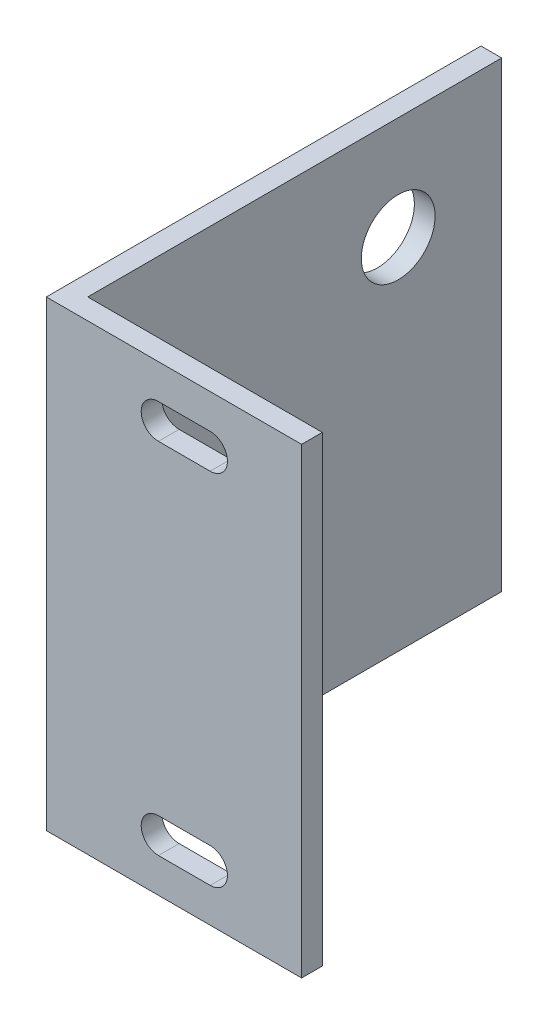
ISO-10303-21;
HEADER;
FILE_DESCRIPTION(('STEP AP214'),'2;1');
FILE_NAME('part.step','',(''),(''),'','','');
FILE_SCHEMA(('AUTOMOTIVE_DESIGN { 1 0 10303 214 1 1 1 1 }'));
ENDSEC;
DATA;
#1=APPLICATION_CONTEXT('core data for automotive mechanical design processes');
#2=APPLICATION_PROTOCOL_DEFINITION('international standard','automotive_design',2000,#1);
#3=PRODUCT_CONTEXT('',#1,'mechanical');
#4=PRODUCT('Part','Part','',(#3));
#5=PRODUCT_RELATED_PRODUCT_CATEGORY('part','',(#4));
#6=PRODUCT_DEFINITION_FORMATION('','',#4);
#7=PRODUCT_DEFINITION_CONTEXT('part definition',#1,'design');
#8=PRODUCT_DEFINITION('design','',#6,#7);
#9=PRODUCT_DEFINITION_SHAPE('','',#8);
#10=(LENGTH_UNIT() NAMED_UNIT(*) SI_UNIT(.MILLI.,.METRE.));
#11=(NAMED_UNIT(*) PLANE_ANGLE_UNIT() SI_UNIT($,.RADIAN.));
#12=(NAMED_UNIT(*) SI_UNIT($,.STERADIAN.) SOLID_ANGLE_UNIT());
#13=UNCERTAINTY_MEASURE_WITH_UNIT(LENGTH_MEASURE(1.E-05),#10,'distance_accuracy_value','');
#14=(GEOMETRIC_REPRESENTATION_CONTEXT(3) GLOBAL_UNCERTAINTY_ASSIGNED_CONTEXT((#13)) GLOBAL_UNIT_ASSIGNED_CONTEXT((#10,
#11,#12)) REPRESENTATION_CONTEXT('',''));
#15=CARTESIAN_POINT('',(0.,0.,0.));
#16=DIRECTION('',(0.,0.,1.));
#17=DIRECTION('',(1.,0.,0.));
#18=AXIS2_PLACEMENT_3D('',#15,#16,#17);
#19=CARTESIAN_POINT('',(-15.5,66.99,0.));
#20=DIRECTION('',(1.,0.,0.));
#21=DIRECTION('',(0.,0.,-1.));
#22=AXIS2_PLACEMENT_3D('',#19,#20,#21);
#23=PLANE('',#22);
#24=CARTESIAN_POINT('',(-15.5,15.,-16.5));
#25=DIRECTION('',(1.,0.,0.));
#26=DIRECTION('',(0.,0.,-1.));
#27=AXIS2_PLACEMENT_3D('',#24,#25,#26);
#28=CIRCLE('',#27,5.35);
#29=CARTESIAN_POINT('',(-15.5,15.,-21.85));
#30=VERTEX_POINT('',#29);
#31=EDGE_CURVE('E244',#30,#30,#28,.T.);
#32=ORIENTED_EDGE('',*,*,#31,.F.);
#33=EDGE_LOOP('',(#32));
#34=FACE_BOUND('',#33,.T.);
#35=CARTESIAN_POINT('',(-15.5,51.9883850012406,-46.5));
#36=DIRECTION('',(1.,0.,0.));
#37=DIRECTION('',(0.,0.,-1.));
#38=AXIS2_PLACEMENT_3D('',#35,#36,#37);
#39=CIRCLE('',#38,5.35);
#40=CARTESIAN_POINT('',(-15.5,51.9883850012406,-51.85));
#41=VERTEX_POINT('',#40);
#42=EDGE_CURVE('E248',#41,#41,#39,.T.);
#43=ORIENTED_EDGE('',*,*,#42,.F.);
#44=EDGE_LOOP('',(#43));
#45=FACE_BOUND('',#44,.T.);
#46=DIRECTION('',(0.,0.,1.));
#47=VECTOR('',#46,1.);
#48=CARTESIAN_POINT('',(-15.5,0.,0.));
#49=LINE('',#48,#47);
#50=CARTESIAN_POINT('',(-15.5,0.,-61.5));
#51=VERTEX_POINT('',#50);
#52=CARTESIAN_POINT('',(-15.5,0.,-1.5));
#53=VERTEX_POINT('',#52);
#54=EDGE_CURVE('E243',#51,#53,#49,.T.);
#55=ORIENTED_EDGE('',*,*,#54,.F.);
#56=DIRECTION('',(0.,-1.,0.));
#57=VECTOR('',#56,1.);
#58=CARTESIAN_POINT('',(-15.5,66.99,-61.5));
#59=LINE('',#58,#57);
#60=CARTESIAN_POINT('',(-15.5,66.99,-61.5));
#61=VERTEX_POINT('',#60);
#62=EDGE_CURVE('E11',#61,#51,#59,.T.);
#63=ORIENTED_EDGE('',*,*,#62,.F.);
#64=DIRECTION('',(0.,0.,1.));
#65=VECTOR('',#64,1.);
#66=CARTESIAN_POINT('',(-15.5,66.99,0.));
#67=LINE('',#66,#65);
#68=CARTESIAN_POINT('',(-15.5,66.99,-1.5));
#69=VERTEX_POINT('',#68);
#70=EDGE_CURVE('E255',#61,#69,#67,.T.);
#71=ORIENTED_EDGE('',*,*,#70,.T.);
#72=DIRECTION('',(0.,-1.,0.));
#73=VECTOR('',#72,1.);
#74=CARTESIAN_POINT('',(-15.5,66.99,-1.5));
#75=LINE('',#74,#73);
#76=EDGE_CURVE('E279',#69,#53,#75,.T.);
#77=ORIENTED_EDGE('',*,*,#76,.T.);
#78=EDGE_LOOP('',(#55,#63,#71,#77));
#79=FACE_BOUND('',#78,.T.);
#80=ADVANCED_FACE('F44',(#34,#45,#79),#23,.T.);
#81=CARTESIAN_POINT('',(0.,66.99,-61.5));
#82=DIRECTION('',(0.,0.,-1.));
#83=DIRECTION('',(-1.,0.,0.));
#84=AXIS2_PLACEMENT_3D('',#81,#82,#83);
#85=PLANE('',#84);
#86=DIRECTION('',(1.,0.,0.));
#87=VECTOR('',#86,1.);
#88=CARTESIAN_POINT('',(0.,0.,-61.5));
#89=LINE('',#88,#87);
#90=CARTESIAN_POINT('',(-18.5,0.,-61.5));
#91=VERTEX_POINT('',#90);
#92=EDGE_CURVE('E283',#91,#51,#89,.T.);
#93=ORIENTED_EDGE('',*,*,#92,.F.);
#94=DIRECTION('',(0.,-1.,0.));
#95=VECTOR('',#94,1.);
#96=CARTESIAN_POINT('',(-18.5,66.99,-61.5));
#97=LINE('',#96,#95);
#98=CARTESIAN_POINT('',(-18.5,66.99,-61.5));
#99=VERTEX_POINT('',#98);
#100=EDGE_CURVE('E52',#99,#91,#97,.T.);
#101=ORIENTED_EDGE('',*,*,#100,.F.);
#102=DIRECTION('',(1.,0.,0.));
#103=VECTOR('',#102,1.);
#104=CARTESIAN_POINT('',(0.,66.99,-61.5));
#105=LINE('',#104,#103);
#106=EDGE_CURVE('E259',#99,#61,#105,.T.);
#107=ORIENTED_EDGE('',*,*,#106,.T.);
#108=ORIENTED_EDGE('',*,*,#62,.T.);
#109=EDGE_LOOP('',(#93,#101,#107,#108));
#110=FACE_BOUND('',#109,.T.);
#111=ADVANCED_FACE('F320',(#110),#85,.T.);
#112=CARTESIAN_POINT('',(-18.5,66.99,0.));
#113=DIRECTION('',(-1.,0.,0.));
#114=DIRECTION('',(0.,0.,1.));
#115=AXIS2_PLACEMENT_3D('',#112,#113,#114);
#116=PLANE('',#115);
#117=CARTESIAN_POINT('',(-18.5,15.,-16.5));
#118=DIRECTION('',(1.,0.,0.));
#119=DIRECTION('',(0.,0.,-1.));
#120=AXIS2_PLACEMENT_3D('',#117,#118,#119);
#121=CIRCLE('',#120,5.35);
#122=CARTESIAN_POINT('',(-18.5,15.,-21.85));
#123=VERTEX_POINT('',#122);
#124=EDGE_CURVE('E239',#123,#123,#121,.T.);
#125=ORIENTED_EDGE('',*,*,#124,.T.);
#126=EDGE_LOOP('',(#125));
#127=FACE_BOUND('',#126,.T.);
#128=CARTESIAN_POINT('',(-18.5,51.9883850012406,-46.5));
#129=DIRECTION('',(1.,0.,0.));
#130=DIRECTION('',(0.,0.,-1.));
#131=AXIS2_PLACEMENT_3D('',#128,#129,#130);
#132=CIRCLE('',#131,5.35);
#133=CARTESIAN_POINT('',(-18.5,51.9883850012406,-51.85));
#134=VERTEX_POINT('',#133);
#135=EDGE_CURVE('E192',#134,#134,#132,.T.);
#136=ORIENTED_EDGE('',*,*,#135,.T.);
#137=EDGE_LOOP('',(#136));
#138=FACE_BOUND('',#137,.T.);
#139=DIRECTION('',(0.,0.,-1.));
#140=VECTOR('',#139,1.);
#141=CARTESIAN_POINT('',(-18.5,0.,0.));
#142=LINE('',#141,#140);
#143=CARTESIAN_POINT('',(-18.5,0.,1.5));
#144=VERTEX_POINT('',#143);
#145=EDGE_CURVE('E287',#144,#91,#142,.T.);
#146=ORIENTED_EDGE('',*,*,#145,.F.);
#147=DIRECTION('',(0.,-1.,0.));
#148=VECTOR('',#147,1.);
#149=CARTESIAN_POINT('',(-18.5,66.99,1.5));
#150=LINE('',#149,#148);
#151=CARTESIAN_POINT('',(-18.5,66.99,1.5));
#152=VERTEX_POINT('',#151);
#153=EDGE_CURVE('E310',#152,#144,#150,.T.);
#154=ORIENTED_EDGE('',*,*,#153,.F.);
#155=DIRECTION('',(0.,0.,-1.));
#156=VECTOR('',#155,1.);
#157=CARTESIAN_POINT('',(-18.5,66.99,0.));
#158=LINE('',#157,#156);
#159=EDGE_CURVE('E264',#152,#99,#158,.T.);
#160=ORIENTED_EDGE('',*,*,#159,.T.);
#161=ORIENTED_EDGE('',*,*,#100,.T.);
#162=EDGE_LOOP('',(#146,#154,#160,#161));
#163=FACE_BOUND('',#162,.T.);
#164=ADVANCED_FACE('F316',(#127,#138,#163),#116,.T.);
#165=CARTESIAN_POINT('',(0.,66.99,1.5));
#166=DIRECTION('',(0.,0.,-1.));
#167=DIRECTION('',(-1.,0.,0.));
#168=AXIS2_PLACEMENT_3D('',#165,#166,#167);
#169=PLANE('',#168);
#170=DIRECTION('',(1.,0.,0.));
#171=VECTOR('',#170,1.);
#172=CARTESIAN_POINT('',(5.25,10.,1.5));
#173=LINE('',#172,#171);
#174=CARTESIAN_POINT('',(-2.25,10.,1.5));
#175=VERTEX_POINT('',#174);
#176=CARTESIAN_POINT('',(5.25,10.,1.5));
#177=VERTEX_POINT('',#176);
#178=EDGE_CURVE('E157',#175,#177,#173,.T.);
#179=ORIENTED_EDGE('',*,*,#178,.T.);
#180=CARTESIAN_POINT('',(5.25,7.5,1.5));
#181=DIRECTION('',(0.,0.,-1.));
#182=DIRECTION('',(-1.,0.,0.));
#183=AXIS2_PLACEMENT_3D('',#180,#181,#182);
#184=CIRCLE('',#183,2.5);
#185=CARTESIAN_POINT('',(5.25,5.,1.5));
#186=VERTEX_POINT('',#185);
#187=EDGE_CURVE('E148',#177,#186,#184,.T.);
#188=ORIENTED_EDGE('',*,*,#187,.T.);
#189=DIRECTION('',(-1.,0.,0.));
#190=VECTOR('',#189,1.);
#191=CARTESIAN_POINT('',(5.25,5.,1.5));
#192=LINE('',#191,#190);
#193=CARTESIAN_POINT('',(-2.25,5.,1.5));
#194=VERTEX_POINT('',#193);
#195=EDGE_CURVE('E160',#186,#194,#192,.T.);
#196=ORIENTED_EDGE('',*,*,#195,.T.);
#197=CARTESIAN_POINT('',(-2.25,7.5,1.5));
#198=DIRECTION('',(0.,0.,-1.));
#199=DIRECTION('',(-1.,0.,0.));
#200=AXIS2_PLACEMENT_3D('',#197,#198,#199);
#201=CIRCLE('',#200,2.5);
#202=EDGE_CURVE('E59',#194,#175,#201,.T.);
#203=ORIENTED_EDGE('',*,*,#202,.T.);
#204=EDGE_LOOP('',(#179,#188,#196,#203));
#205=FACE_BOUND('',#204,.T.);
#206=DIRECTION('',(1.,0.,0.));
#207=VECTOR('',#206,1.);
#208=CARTESIAN_POINT('',(5.25,61.99,1.5));
#209=LINE('',#208,#207);
#210=CARTESIAN_POINT('',(-2.25,61.99,1.5));
#211=VERTEX_POINT('',#210);
#212=CARTESIAN_POINT('',(5.25,61.99,1.5));
#213=VERTEX_POINT('',#212);
#214=EDGE_CURVE('E202',#211,#213,#209,.T.);
#215=ORIENTED_EDGE('',*,*,#214,.T.);
#216=CARTESIAN_POINT('',(5.25,59.49,1.5));
#217=DIRECTION('',(0.,0.,-1.));
#218=DIRECTION('',(1.,0.,0.));
#219=AXIS2_PLACEMENT_3D('',#216,#217,#218);
#220=CIRCLE('',#219,2.5);
#221=CARTESIAN_POINT('',(5.25,56.99,1.5));
#222=VERTEX_POINT('',#221);
#223=EDGE_CURVE('E217',#213,#222,#220,.T.);
#224=ORIENTED_EDGE('',*,*,#223,.T.);
#225=DIRECTION('',(-1.,0.,0.));
#226=VECTOR('',#225,1.);
#227=CARTESIAN_POINT('',(5.25,56.99,1.5));
#228=LINE('',#227,#226);
#229=CARTESIAN_POINT('',(-2.25,56.99,1.5));
#230=VERTEX_POINT('',#229);
#231=EDGE_CURVE('E232',#222,#230,#228,.T.);
#232=ORIENTED_EDGE('',*,*,#231,.T.);
#233=CARTESIAN_POINT('',(-2.25,59.49,1.5));
#234=DIRECTION('',(0.,0.,-1.));
#235=DIRECTION('',(1.,0.,0.));
#236=AXIS2_PLACEMENT_3D('',#233,#234,#235);
#237=CIRCLE('',#236,2.5);
#238=EDGE_CURVE('E67',#230,#211,#237,.T.);
#239=ORIENTED_EDGE('',*,*,#238,.T.);
#240=EDGE_LOOP('',(#215,#224,#232,#239));
#241=FACE_BOUND('',#240,.T.);
#242=DIRECTION('',(1.,0.,0.));
#243=VECTOR('',#242,1.);
#244=CARTESIAN_POINT('',(0.,0.,1.5));
#245=LINE('',#244,#243);
#246=CARTESIAN_POINT('',(18.5,0.,1.5));
#247=VERTEX_POINT('',#246);
#248=EDGE_CURVE('E291',#144,#247,#245,.T.);
#249=ORIENTED_EDGE('',*,*,#248,.T.);
#250=DIRECTION('',(0.,-1.,0.));
#251=VECTOR('',#250,1.);
#252=CARTESIAN_POINT('',(18.5,66.99,1.5));
#253=LINE('',#252,#251);
#254=CARTESIAN_POINT('',(18.5,66.99,1.5));
#255=VERTEX_POINT('',#254);
#256=EDGE_CURVE('E307',#255,#247,#253,.T.);
#257=ORIENTED_EDGE('',*,*,#256,.F.);
#258=DIRECTION('',(1.,0.,0.));
#259=VECTOR('',#258,1.);
#260=CARTESIAN_POINT('',(0.,66.99,1.5));
#261=LINE('',#260,#259);
#262=EDGE_CURVE('E268',#152,#255,#261,.T.);
#263=ORIENTED_EDGE('',*,*,#262,.F.);
#264=ORIENTED_EDGE('',*,*,#153,.T.);
#265=EDGE_LOOP('',(#249,#257,#263,#264));
#266=FACE_BOUND('',#265,.T.);
#267=ADVANCED_FACE('F165',(#205,#241,#266),#169,.F.);
#268=CARTESIAN_POINT('',(18.5,66.99,0.));
#269=DIRECTION('',(1.,0.,0.));
#270=DIRECTION('',(0.,0.,-1.));
#271=AXIS2_PLACEMENT_3D('',#268,#269,#270);
#272=PLANE('',#271);
#273=DIRECTION('',(0.,0.,1.));
#274=VECTOR('',#273,1.);
#275=CARTESIAN_POINT('',(18.5,0.,0.));
#276=LINE('',#275,#274);
#277=CARTESIAN_POINT('',(18.5,0.,-1.5));
#278=VERTEX_POINT('',#277);
#279=EDGE_CURVE('E295',#278,#247,#276,.T.);
#280=ORIENTED_EDGE('',*,*,#279,.F.);
#281=DIRECTION('',(0.,-1.,0.));
#282=VECTOR('',#281,1.);
#283=CARTESIAN_POINT('',(18.5,66.99,-1.5));
#284=LINE('',#283,#282);
#285=CARTESIAN_POINT('',(18.5,66.99,-1.5));
#286=VERTEX_POINT('',#285);
#287=EDGE_CURVE('E304',#286,#278,#284,.T.);
#288=ORIENTED_EDGE('',*,*,#287,.F.);
#289=DIRECTION('',(0.,0.,1.));
#290=VECTOR('',#289,1.);
#291=CARTESIAN_POINT('',(18.5,66.99,0.));
#292=LINE('',#291,#290);
#293=EDGE_CURVE('E271',#286,#255,#292,.T.);
#294=ORIENTED_EDGE('',*,*,#293,.T.);
#295=ORIENTED_EDGE('',*,*,#256,.T.);
#296=EDGE_LOOP('',(#280,#288,#294,#295));
#297=FACE_BOUND('',#296,.T.);
#298=ADVANCED_FACE('F339',(#297),#272,.T.);
#299=CARTESIAN_POINT('',(0.,66.99,-1.5));
#300=DIRECTION('',(0.,0.,-1.));
#301=DIRECTION('',(-1.,0.,0.));
#302=AXIS2_PLACEMENT_3D('',#299,#300,#301);
#303=PLANE('',#302);
#304=CARTESIAN_POINT('',(5.25,7.5,-1.5));
#305=DIRECTION('',(0.,0.,-1.));
#306=DIRECTION('',(-1.,0.,0.));
#307=AXIS2_PLACEMENT_3D('',#304,#305,#306);
#308=CIRCLE('',#307,2.5);
#309=CARTESIAN_POINT('',(5.25,10.,-1.5));
#310=VERTEX_POINT('',#309);
#311=CARTESIAN_POINT('',(5.25,5.,-1.5));
#312=VERTEX_POINT('',#311);
#313=EDGE_CURVE('E151',#310,#312,#308,.T.);
#314=ORIENTED_EDGE('',*,*,#313,.F.);
#315=DIRECTION('',(1.,0.,0.));
#316=VECTOR('',#315,1.);
#317=CARTESIAN_POINT('',(5.25,10.,-1.5));
#318=LINE('',#317,#316);
#319=CARTESIAN_POINT('',(-2.25,10.,-1.5));
#320=VERTEX_POINT('',#319);
#321=EDGE_CURVE('E169',#320,#310,#318,.T.);
#322=ORIENTED_EDGE('',*,*,#321,.F.);
#323=CARTESIAN_POINT('',(-2.25,7.5,-1.5));
#324=DIRECTION('',(0.,0.,-1.));
#325=DIRECTION('',(-1.,0.,0.));
#326=AXIS2_PLACEMENT_3D('',#323,#324,#325);
#327=CIRCLE('',#326,2.5);
#328=CARTESIAN_POINT('',(-2.25,5.,-1.5));
#329=VERTEX_POINT('',#328);
#330=EDGE_CURVE('E173',#329,#320,#327,.T.);
#331=ORIENTED_EDGE('',*,*,#330,.F.);
#332=DIRECTION('',(-1.,0.,0.));
#333=VECTOR('',#332,1.);
#334=CARTESIAN_POINT('',(5.25,5.,-1.5));
#335=LINE('',#334,#333);
#336=EDGE_CURVE('E182',#312,#329,#335,.T.);
#337=ORIENTED_EDGE('',*,*,#336,.F.);
#338=EDGE_LOOP('',(#314,#322,#331,#337));
#339=FACE_BOUND('',#338,.T.);
#340=CARTESIAN_POINT('',(5.25,59.49,-1.5));
#341=DIRECTION('',(0.,0.,-1.));
#342=DIRECTION('',(1.,0.,0.));
#343=AXIS2_PLACEMENT_3D('',#340,#341,#342);
#344=CIRCLE('',#343,2.5);
#345=CARTESIAN_POINT('',(5.25,61.99,-1.5));
#346=VERTEX_POINT('',#345);
#347=CARTESIAN_POINT('',(5.25,56.99,-1.5));
#348=VERTEX_POINT('',#347);
#349=EDGE_CURVE('E183',#346,#348,#344,.T.);
#350=ORIENTED_EDGE('',*,*,#349,.F.);
#351=DIRECTION('',(1.,0.,0.));
#352=VECTOR('',#351,1.);
#353=CARTESIAN_POINT('',(5.25,61.99,-1.5));
#354=LINE('',#353,#352);
#355=CARTESIAN_POINT('',(-2.25,61.99,-1.5));
#356=VERTEX_POINT('',#355);
#357=EDGE_CURVE('E212',#356,#346,#354,.T.);
#358=ORIENTED_EDGE('',*,*,#357,.F.);
#359=CARTESIAN_POINT('',(-2.25,59.49,-1.5));
#360=DIRECTION('',(0.,0.,-1.));
#361=DIRECTION('',(1.,0.,0.));
#362=AXIS2_PLACEMENT_3D('',#359,#360,#361);
#363=CIRCLE('',#362,2.5);
#364=CARTESIAN_POINT('',(-2.25,56.99,-1.5));
#365=VERTEX_POINT('',#364);
#366=EDGE_CURVE('E216',#365,#356,#363,.T.);
#367=ORIENTED_EDGE('',*,*,#366,.F.);
#368=DIRECTION('',(-1.,0.,0.));
#369=VECTOR('',#368,1.);
#370=CARTESIAN_POINT('',(5.25,56.99,-1.5));
#371=LINE('',#370,#369);
#372=EDGE_CURVE('E221',#348,#365,#371,.T.);
#373=ORIENTED_EDGE('',*,*,#372,.F.);
#374=EDGE_LOOP('',(#350,#358,#367,#373));
#375=FACE_BOUND('',#374,.T.);
#376=DIRECTION('',(1.,0.,0.));
#377=VECTOR('',#376,1.);
#378=CARTESIAN_POINT('',(0.,0.,-1.5));
#379=LINE('',#378,#377);
#380=EDGE_CURVE('E260',#53,#278,#379,.T.);
#381=ORIENTED_EDGE('',*,*,#380,.F.);
#382=ORIENTED_EDGE('',*,*,#76,.F.);
#383=DIRECTION('',(1.,0.,0.));
#384=VECTOR('',#383,1.);
#385=CARTESIAN_POINT('',(0.,66.99,-1.5));
#386=LINE('',#385,#384);
#387=EDGE_CURVE('E275',#69,#286,#386,.T.);
#388=ORIENTED_EDGE('',*,*,#387,.T.);
#389=ORIENTED_EDGE('',*,*,#287,.T.);
#390=EDGE_LOOP('',(#381,#382,#388,#389));
#391=FACE_BOUND('',#390,.T.);
#392=ADVANCED_FACE('F337',(#339,#375,#391),#303,.T.);
#393=CARTESIAN_POINT('',(0.,66.99,0.));
#394=DIRECTION('',(0.,1.,0.));
#395=DIRECTION('',(0.,0.,1.));
#396=AXIS2_PLACEMENT_3D('',#393,#394,#395);
#397=PLANE('',#396);
#398=ORIENTED_EDGE('',*,*,#70,.F.);
#399=ORIENTED_EDGE('',*,*,#106,.F.);
#400=ORIENTED_EDGE('',*,*,#159,.F.);
#401=ORIENTED_EDGE('',*,*,#262,.T.);
#402=ORIENTED_EDGE('',*,*,#293,.F.);
#403=ORIENTED_EDGE('',*,*,#387,.F.);
#404=EDGE_LOOP('',(#398,#399,#400,#401,#402,#403));
#405=FACE_BOUND('',#404,.T.);
#406=ADVANCED_FACE('F332',(#405),#397,.T.);
#407=CARTESIAN_POINT('',(0.,0.,0.));
#408=DIRECTION('',(0.,1.,0.));
#409=DIRECTION('',(0.,0.,1.));
#410=AXIS2_PLACEMENT_3D('',#407,#408,#409);
#411=PLANE('',#410);
#412=ORIENTED_EDGE('',*,*,#54,.T.);
#413=ORIENTED_EDGE('',*,*,#380,.T.);
#414=ORIENTED_EDGE('',*,*,#279,.T.);
#415=ORIENTED_EDGE('',*,*,#248,.F.);
#416=ORIENTED_EDGE('',*,*,#145,.T.);
#417=ORIENTED_EDGE('',*,*,#92,.T.);
#418=EDGE_LOOP('',(#412,#413,#414,#415,#416,#417));
#419=FACE_BOUND('',#418,.T.);
#420=ADVANCED_FACE('F324',(#419),#411,.F.);
#421=CARTESIAN_POINT('',(-18.5,51.9883850012406,-46.5));
#422=DIRECTION('',(1.,0.,0.));
#423=DIRECTION('',(0.,0.,-1.));
#424=AXIS2_PLACEMENT_3D('',#421,#422,#423);
#425=CYLINDRICAL_SURFACE('',#424,5.35);
#426=CARTESIAN_POINT('',(-18.5,51.9883850012406,-51.85));
#427=CARTESIAN_POINT('',(-18.46875,51.9883850012406,-51.85));
#428=CARTESIAN_POINT('',(-18.4375,51.9883850012406,-51.85));
#429=CARTESIAN_POINT('',(-18.375,51.9883850012406,-51.85));
#430=CARTESIAN_POINT('',(-18.34375,51.9883850012406,-51.85));
#431=CARTESIAN_POINT('',(-18.28125,51.9883850012406,-51.85));
#432=CARTESIAN_POINT('',(-18.25,51.9883850012406,-51.85));
#433=CARTESIAN_POINT('',(-18.1875,51.9883850012406,-51.85));
#434=CARTESIAN_POINT('',(-18.15625,51.9883850012406,-51.85));
#435=CARTESIAN_POINT('',(-18.09375,51.9883850012406,-51.85));
#436=CARTESIAN_POINT('',(-18.0625,51.9883850012406,-51.85));
#437=CARTESIAN_POINT('',(-18.,51.9883850012406,-51.85));
#438=CARTESIAN_POINT('',(-17.96875,51.9883850012406,-51.85));
#439=CARTESIAN_POINT('',(-17.90625,51.9883850012406,-51.85));
#440=CARTESIAN_POINT('',(-17.875,51.9883850012406,-51.85));
#441=CARTESIAN_POINT('',(-17.8125,51.9883850012406,-51.85));
#442=CARTESIAN_POINT('',(-17.78125,51.9883850012406,-51.85));
#443=CARTESIAN_POINT('',(-17.71875,51.9883850012406,-51.85));
#444=CARTESIAN_POINT('',(-17.6875,51.9883850012406,-51.85));
#445=CARTESIAN_POINT('',(-17.625,51.9883850012406,-51.85));
#446=CARTESIAN_POINT('',(-17.59375,51.9883850012406,-51.85));
#447=CARTESIAN_POINT('',(-17.53125,51.9883850012406,-51.85));
#448=CARTESIAN_POINT('',(-17.5,51.9883850012406,-51.85));
#449=CARTESIAN_POINT('',(-17.4375,51.9883850012406,-51.85));
#450=CARTESIAN_POINT('',(-17.40625,51.9883850012406,-51.85));
#451=CARTESIAN_POINT('',(-17.34375,51.9883850012406,-51.85));
#452=CARTESIAN_POINT('',(-17.3125,51.9883850012406,-51.85));
#453=CARTESIAN_POINT('',(-17.25,51.9883850012406,-51.85));
#454=CARTESIAN_POINT('',(-17.21875,51.9883850012406,-51.85));
#455=CARTESIAN_POINT('',(-17.15625,51.9883850012406,-51.85));
#456=CARTESIAN_POINT('',(-17.125,51.9883850012406,-51.85));
#457=CARTESIAN_POINT('',(-17.0625,51.9883850012406,-51.85));
#458=CARTESIAN_POINT('',(-17.03125,51.9883850012406,-51.85));
#459=CARTESIAN_POINT('',(-16.96875,51.9883850012406,-51.85));
#460=CARTESIAN_POINT('',(-16.9375,51.9883850012406,-51.85));
#461=CARTESIAN_POINT('',(-16.875,51.9883850012406,-51.85));
#462=CARTESIAN_POINT('',(-16.84375,51.9883850012406,-51.85));
#463=CARTESIAN_POINT('',(-16.78125,51.9883850012406,-51.85));
#464=CARTESIAN_POINT('',(-16.75,51.9883850012406,-51.85));
#465=CARTESIAN_POINT('',(-16.6875,51.9883850012406,-51.85));
#466=CARTESIAN_POINT('',(-16.65625,51.9883850012406,-51.85));
#467=CARTESIAN_POINT('',(-16.59375,51.9883850012406,-51.85));
#468=CARTESIAN_POINT('',(-16.5625,51.9883850012406,-51.85));
#469=CARTESIAN_POINT('',(-16.5,51.9883850012406,-51.85));
#470=CARTESIAN_POINT('',(-16.46875,51.9883850012406,-51.85));
#471=CARTESIAN_POINT('',(-16.40625,51.9883850012406,-51.85));
#472=CARTESIAN_POINT('',(-16.375,51.9883850012406,-51.85));
#473=CARTESIAN_POINT('',(-16.3125,51.9883850012406,-51.85));
#474=CARTESIAN_POINT('',(-16.28125,51.9883850012406,-51.85));
#475=CARTESIAN_POINT('',(-16.21875,51.9883850012406,-51.85));
#476=CARTESIAN_POINT('',(-16.1875,51.9883850012406,-51.85));
#477=CARTESIAN_POINT('',(-16.125,51.9883850012406,-51.85));
#478=CARTESIAN_POINT('',(-16.09375,51.9883850012406,-51.85));
#479=CARTESIAN_POINT('',(-16.03125,51.9883850012406,-51.85));
#480=CARTESIAN_POINT('',(-16.,51.9883850012406,-51.85));
#481=CARTESIAN_POINT('',(-15.9375,51.9883850012406,-51.85));
#482=CARTESIAN_POINT('',(-15.90625,51.9883850012406,-51.85));
#483=CARTESIAN_POINT('',(-15.84375,51.9883850012406,-51.85));
#484=CARTESIAN_POINT('',(-15.8125,51.9883850012406,-51.85));
#485=CARTESIAN_POINT('',(-15.75,51.9883850012406,-51.85));
#486=CARTESIAN_POINT('',(-15.71875,51.9883850012406,-51.85));
#487=CARTESIAN_POINT('',(-15.65625,51.9883850012406,-51.85));
#488=CARTESIAN_POINT('',(-15.625,51.9883850012406,-51.85));
#489=CARTESIAN_POINT('',(-15.5625,51.9883850012406,-51.85));
#490=CARTESIAN_POINT('',(-15.53125,51.9883850012406,-51.85));
#491=CARTESIAN_POINT('',(-15.5,51.9883850012406,-51.85));
#492=B_SPLINE_CURVE_WITH_KNOTS('',3,(#426,#427,#428,#429,#430,#431,#432,#433,#434,#435,#436,
#437,#438,#439,#440,#441,#442,#443,#444,#445,#446,#447,#448,#449,#450,#451,#452,#453,#454,#455,
#456,#457,#458,#459,#460,#461,#462,#463,#464,#465,#466,#467,#468,#469,#470,#471,#472,#473,#474,
#475,#476,#477,#478,#479,#480,#481,#482,#483,#484,#485,#486,#487,#488,#489,#490,#491),
.UNSPECIFIED.,.F.,.F.,(4,2,2,2,2,2,2,2,2,2,2,2,2,2,2,2,2,2,2,2,2,2,2,2,2,2,2,2,2,2,2,2,4),(0.,
0.0937500000000001,0.1875,0.28125,0.375,0.46875,0.5625,0.656250000000001,0.750000000000001,
0.843750000000001,0.937500000000001,1.03125,1.125,1.21875,1.3125,1.40625,1.5,1.59375,1.6875,
1.78125,1.875,1.96875,2.0625,2.15625,2.25,2.34375,2.4375,2.53125,2.62500000000001,2.71875,
2.81250000000001,2.90625,3.),.UNSPECIFIED.);
#493=EDGE_CURVE('BSEAM358',#134,#41,#492,.T.);
#494=ORIENTED_EDGE('',*,*,#135,.F.);
#495=ORIENTED_EDGE('',*,*,#42,.T.);
#496=ORIENTED_EDGE('',*,*,#493,.T.);
#497=ORIENTED_EDGE('',*,*,#493,.F.);
#498=EDGE_LOOP('',(#494,#496,#495,#497));
#499=FACE_BOUND('',#498,.T.);
#500=ADVANCED_FACE('F358',(#499),#425,.F.);
#501=CARTESIAN_POINT('',(-18.5,15.,-16.5));
#502=DIRECTION('',(1.,0.,0.));
#503=DIRECTION('',(0.,0.,-1.));
#504=AXIS2_PLACEMENT_3D('',#501,#502,#503);
#505=CYLINDRICAL_SURFACE('',#504,5.35);
#506=CARTESIAN_POINT('',(-18.5,15.,-21.85));
#507=CARTESIAN_POINT('',(-18.46875,15.,-21.85));
#508=CARTESIAN_POINT('',(-18.4375,15.,-21.85));
#509=CARTESIAN_POINT('',(-18.375,15.,-21.85));
#510=CARTESIAN_POINT('',(-18.34375,15.,-21.85));
#511=CARTESIAN_POINT('',(-18.28125,15.,-21.85));
#512=CARTESIAN_POINT('',(-18.25,15.,-21.85));
#513=CARTESIAN_POINT('',(-18.1875,15.,-21.85));
#514=CARTESIAN_POINT('',(-18.15625,15.,-21.85));
#515=CARTESIAN_POINT('',(-18.09375,15.,-21.85));
#516=CARTESIAN_POINT('',(-18.0625,15.,-21.85));
#517=CARTESIAN_POINT('',(-18.,15.,-21.85));
#518=CARTESIAN_POINT('',(-17.96875,15.,-21.85));
#519=CARTESIAN_POINT('',(-17.90625,15.,-21.85));
#520=CARTESIAN_POINT('',(-17.875,15.,-21.85));
#521=CARTESIAN_POINT('',(-17.8125,15.,-21.85));
#522=CARTESIAN_POINT('',(-17.78125,15.,-21.85));
#523=CARTESIAN_POINT('',(-17.71875,15.,-21.85));
#524=CARTESIAN_POINT('',(-17.6875,15.,-21.85));
#525=CARTESIAN_POINT('',(-17.625,15.,-21.85));
#526=CARTESIAN_POINT('',(-17.59375,15.,-21.85));
#527=CARTESIAN_POINT('',(-17.53125,15.,-21.85));
#528=CARTESIAN_POINT('',(-17.5,15.,-21.85));
#529=CARTESIAN_POINT('',(-17.4375,15.,-21.85));
#530=CARTESIAN_POINT('',(-17.40625,15.,-21.85));
#531=CARTESIAN_POINT('',(-17.34375,15.,-21.85));
#532=CARTESIAN_POINT('',(-17.3125,15.,-21.85));
#533=CARTESIAN_POINT('',(-17.25,15.,-21.85));
#534=CARTESIAN_POINT('',(-17.21875,15.,-21.85));
#535=CARTESIAN_POINT('',(-17.15625,15.,-21.85));
#536=CARTESIAN_POINT('',(-17.125,15.,-21.85));
#537=CARTESIAN_POINT('',(-17.0625,15.,-21.85));
#538=CARTESIAN_POINT('',(-17.03125,15.,-21.85));
#539=CARTESIAN_POINT('',(-16.96875,15.,-21.85));
#540=CARTESIAN_POINT('',(-16.9375,15.,-21.85));
#541=CARTESIAN_POINT('',(-16.875,15.,-21.85));
#542=CARTESIAN_POINT('',(-16.84375,15.,-21.85));
#543=CARTESIAN_POINT('',(-16.78125,15.,-21.85));
#544=CARTESIAN_POINT('',(-16.75,15.,-21.85));
#545=CARTESIAN_POINT('',(-16.6875,15.,-21.85));
#546=CARTESIAN_POINT('',(-16.65625,15.,-21.85));
#547=CARTESIAN_POINT('',(-16.59375,15.,-21.85));
#548=CARTESIAN_POINT('',(-16.5625,15.,-21.85));
#549=CARTESIAN_POINT('',(-16.5,15.,-21.85));
#550=CARTESIAN_POINT('',(-16.46875,15.,-21.85));
#551=CARTESIAN_POINT('',(-16.40625,15.,-21.85));
#552=CARTESIAN_POINT('',(-16.375,15.,-21.85));
#553=CARTESIAN_POINT('',(-16.3125,15.,-21.85));
#554=CARTESIAN_POINT('',(-16.28125,15.,-21.85));
#555=CARTESIAN_POINT('',(-16.21875,15.,-21.85));
#556=CARTESIAN_POINT('',(-16.1875,15.,-21.85));
#557=CARTESIAN_POINT('',(-16.125,15.,-21.85));
#558=CARTESIAN_POINT('',(-16.09375,15.,-21.85));
#559=CARTESIAN_POINT('',(-16.03125,15.,-21.85));
#560=CARTESIAN_POINT('',(-16.,15.,-21.85));
#561=CARTESIAN_POINT('',(-15.9375,15.,-21.85));
#562=CARTESIAN_POINT('',(-15.90625,15.,-21.85));
#563=CARTESIAN_POINT('',(-15.84375,15.,-21.85));
#564=CARTESIAN_POINT('',(-15.8125,15.,-21.85));
#565=CARTESIAN_POINT('',(-15.75,15.,-21.85));
#566=CARTESIAN_POINT('',(-15.71875,15.,-21.85));
#567=CARTESIAN_POINT('',(-15.65625,15.,-21.85));
#568=CARTESIAN_POINT('',(-15.625,15.,-21.85));
#569=CARTESIAN_POINT('',(-15.5625,15.,-21.85));
#570=CARTESIAN_POINT('',(-15.53125,15.,-21.85));
#571=CARTESIAN_POINT('',(-15.5,15.,-21.85));
#572=B_SPLINE_CURVE_WITH_KNOTS('',3,(#506,#507,#508,#509,#510,#511,#512,#513,#514,#515,#516,
#517,#518,#519,#520,#521,#522,#523,#524,#525,#526,#527,#528,#529,#530,#531,#532,#533,#534,#535,
#536,#537,#538,#539,#540,#541,#542,#543,#544,#545,#546,#547,#548,#549,#550,#551,#552,#553,#554,
#555,#556,#557,#558,#559,#560,#561,#562,#563,#564,#565,#566,#567,#568,#569,#570,#571),
.UNSPECIFIED.,.F.,.F.,(4,2,2,2,2,2,2,2,2,2,2,2,2,2,2,2,2,2,2,2,2,2,2,2,2,2,2,2,2,2,2,2,4),(0.,
0.0937500000000001,0.1875,0.28125,0.375,0.46875,0.5625,0.656250000000001,0.750000000000001,
0.843750000000001,0.937500000000001,1.03125,1.125,1.21875,1.3125,1.40625,1.5,1.59375,1.6875,
1.78125,1.875,1.96875,2.0625,2.15625,2.25,2.34375,2.4375,2.53125,2.625,2.71875,2.8125,2.90625,
3.),.UNSPECIFIED.);
#573=EDGE_CURVE('BSEAM360',#123,#30,#572,.T.);
#574=ORIENTED_EDGE('',*,*,#124,.F.);
#575=ORIENTED_EDGE('',*,*,#31,.T.);
#576=ORIENTED_EDGE('',*,*,#573,.T.);
#577=ORIENTED_EDGE('',*,*,#573,.F.);
#578=EDGE_LOOP('',(#574,#576,#575,#577));
#579=FACE_BOUND('',#578,.T.);
#580=ADVANCED_FACE('F360',(#579),#505,.F.);
#581=CARTESIAN_POINT('',(5.25,59.49,1.5));
#582=DIRECTION('',(0.,0.,-1.));
#583=DIRECTION('',(-1.,0.,0.));
#584=AXIS2_PLACEMENT_3D('',#581,#582,#583);
#585=CYLINDRICAL_SURFACE('',#584,2.5);
#586=ORIENTED_EDGE('',*,*,#349,.T.);
#587=DIRECTION('',(0.,0.,-1.));
#588=VECTOR('',#587,1.);
#589=CARTESIAN_POINT('',(5.25,56.99,1.5));
#590=LINE('',#589,#588);
#591=EDGE_CURVE('E198',#222,#348,#590,.T.);
#592=ORIENTED_EDGE('',*,*,#591,.F.);
#593=ORIENTED_EDGE('',*,*,#223,.F.);
#594=DIRECTION('',(0.,0.,-1.));
#595=VECTOR('',#594,1.);
#596=CARTESIAN_POINT('',(5.25,61.99,1.5));
#597=LINE('',#596,#595);
#598=EDGE_CURVE('E209',#213,#346,#597,.T.);
#599=ORIENTED_EDGE('',*,*,#598,.T.);
#600=EDGE_LOOP('',(#586,#592,#593,#599));
#601=FACE_BOUND('',#600,.T.);
#602=ADVANCED_FACE('F367',(#601),#585,.F.);
#603=CARTESIAN_POINT('',(5.25,61.99,1.5));
#604=DIRECTION('',(0.,1.,0.));
#605=DIRECTION('',(0.,0.,1.));
#606=AXIS2_PLACEMENT_3D('',#603,#604,#605);
#607=PLANE('',#606);
#608=ORIENTED_EDGE('',*,*,#357,.T.);
#609=ORIENTED_EDGE('',*,*,#598,.F.);
#610=ORIENTED_EDGE('',*,*,#214,.F.);
#611=DIRECTION('',(0.,0.,-1.));
#612=VECTOR('',#611,1.);
#613=CARTESIAN_POINT('',(-2.25,61.99,1.5));
#614=LINE('',#613,#612);
#615=EDGE_CURVE('E206',#211,#356,#614,.T.);
#616=ORIENTED_EDGE('',*,*,#615,.T.);
#617=EDGE_LOOP('',(#608,#609,#610,#616));
#618=FACE_BOUND('',#617,.T.);
#619=ADVANCED_FACE('F435',(#618),#607,.F.);
#620=CARTESIAN_POINT('',(-2.25,59.49,1.5));
#621=DIRECTION('',(0.,0.,-1.));
#622=DIRECTION('',(-1.,0.,0.));
#623=AXIS2_PLACEMENT_3D('',#620,#621,#622);
#624=CYLINDRICAL_SURFACE('',#623,2.5);
#625=ORIENTED_EDGE('',*,*,#366,.T.);
#626=ORIENTED_EDGE('',*,*,#615,.F.);
#627=ORIENTED_EDGE('',*,*,#238,.F.);
#628=DIRECTION('',(0.,0.,-1.));
#629=VECTOR('',#628,1.);
#630=CARTESIAN_POINT('',(-2.25,56.99,1.5));
#631=LINE('',#630,#629);
#632=EDGE_CURVE('E203',#230,#365,#631,.T.);
#633=ORIENTED_EDGE('',*,*,#632,.T.);
#634=EDGE_LOOP('',(#625,#626,#627,#633));
#635=FACE_BOUND('',#634,.T.);
#636=ADVANCED_FACE('F446',(#635),#624,.F.);
#637=CARTESIAN_POINT('',(5.25,56.99,1.5));
#638=DIRECTION('',(0.,-1.,0.));
#639=DIRECTION('',(0.,0.,-1.));
#640=AXIS2_PLACEMENT_3D('',#637,#638,#639);
#641=PLANE('',#640);
#642=ORIENTED_EDGE('',*,*,#372,.T.);
#643=ORIENTED_EDGE('',*,*,#632,.F.);
#644=ORIENTED_EDGE('',*,*,#231,.F.);
#645=ORIENTED_EDGE('',*,*,#591,.T.);
#646=EDGE_LOOP('',(#642,#643,#644,#645));
#647=FACE_BOUND('',#646,.T.);
#648=ADVANCED_FACE('F456',(#647),#641,.F.);
#649=CARTESIAN_POINT('',(5.25,7.5,1.5));
#650=DIRECTION('',(0.,0.,-1.));
#651=DIRECTION('',(-1.,0.,0.));
#652=AXIS2_PLACEMENT_3D('',#649,#650,#651);
#653=CYLINDRICAL_SURFACE('',#652,2.5);
#654=ORIENTED_EDGE('',*,*,#313,.T.);
#655=DIRECTION('',(0.,0.,-1.));
#656=VECTOR('',#655,1.);
#657=CARTESIAN_POINT('',(5.25,5.,1.5));
#658=LINE('',#657,#656);
#659=EDGE_CURVE('E144',#186,#312,#658,.T.);
#660=ORIENTED_EDGE('',*,*,#659,.F.);
#661=ORIENTED_EDGE('',*,*,#187,.F.);
#662=DIRECTION('',(0.,0.,-1.));
#663=VECTOR('',#662,1.);
#664=CARTESIAN_POINT('',(5.25,10.,1.5));
#665=LINE('',#664,#663);
#666=EDGE_CURVE('E189',#177,#310,#665,.T.);
#667=ORIENTED_EDGE('',*,*,#666,.T.);
#668=EDGE_LOOP('',(#654,#660,#661,#667));
#669=FACE_BOUND('',#668,.T.);
#670=ADVANCED_FACE('F146',(#669),#653,.F.);
#671=CARTESIAN_POINT('',(5.25,10.,1.5));
#672=DIRECTION('',(0.,1.,0.));
#673=DIRECTION('',(-1.,0.,0.));
#674=AXIS2_PLACEMENT_3D('',#671,#672,#673);
#675=PLANE('',#674);
#676=ORIENTED_EDGE('',*,*,#321,.T.);
#677=ORIENTED_EDGE('',*,*,#666,.F.);
#678=ORIENTED_EDGE('',*,*,#178,.F.);
#679=DIRECTION('',(0.,0.,-1.));
#680=VECTOR('',#679,1.);
#681=CARTESIAN_POINT('',(-2.25,10.,1.5));
#682=LINE('',#681,#680);
#683=EDGE_CURVE('E193',#175,#320,#682,.T.);
#684=ORIENTED_EDGE('',*,*,#683,.T.);
#685=EDGE_LOOP('',(#676,#677,#678,#684));
#686=FACE_BOUND('',#685,.T.);
#687=ADVANCED_FACE('F476',(#686),#675,.F.);
#688=CARTESIAN_POINT('',(-2.25,7.5,1.5));
#689=DIRECTION('',(0.,0.,-1.));
#690=DIRECTION('',(-1.,0.,0.));
#691=AXIS2_PLACEMENT_3D('',#688,#689,#690);
#692=CYLINDRICAL_SURFACE('',#691,2.5);
#693=ORIENTED_EDGE('',*,*,#330,.T.);
#694=ORIENTED_EDGE('',*,*,#683,.F.);
#695=ORIENTED_EDGE('',*,*,#202,.F.);
#696=DIRECTION('',(0.,0.,-1.));
#697=VECTOR('',#696,1.);
#698=CARTESIAN_POINT('',(-2.25,5.,1.5));
#699=LINE('',#698,#697);
#700=EDGE_CURVE('E156',#194,#329,#699,.T.);
#701=ORIENTED_EDGE('',*,*,#700,.T.);
#702=EDGE_LOOP('',(#693,#694,#695,#701));
#703=FACE_BOUND('',#702,.T.);
#704=ADVANCED_FACE('F486',(#703),#692,.F.);
#705=CARTESIAN_POINT('',(5.25,5.,1.5));
#706=DIRECTION('',(0.,-1.,0.));
#707=DIRECTION('',(1.,0.,0.));
#708=AXIS2_PLACEMENT_3D('',#705,#706,#707);
#709=PLANE('',#708);
#710=ORIENTED_EDGE('',*,*,#336,.T.);
#711=ORIENTED_EDGE('',*,*,#700,.F.);
#712=ORIENTED_EDGE('',*,*,#195,.F.);
#713=ORIENTED_EDGE('',*,*,#659,.T.);
#714=EDGE_LOOP('',(#710,#711,#712,#713));
#715=FACE_BOUND('',#714,.T.);
#716=ADVANCED_FACE('F161',(#715),#709,.F.);
#717=CLOSED_SHELL('',(#80,#111,#164,#267,#298,#392,#406,#420,#500,#580,#602,#619,#636,#648,#670,
#687,#704,#716));
#718=MANIFOLD_SOLID_BREP('B2',#717);
#719=ADVANCED_BREP_SHAPE_REPRESENTATION('',(#18,#718),#14);
#720=SHAPE_DEFINITION_REPRESENTATION(#9,#719);
ENDSEC;
END-ISO-10303-21;
